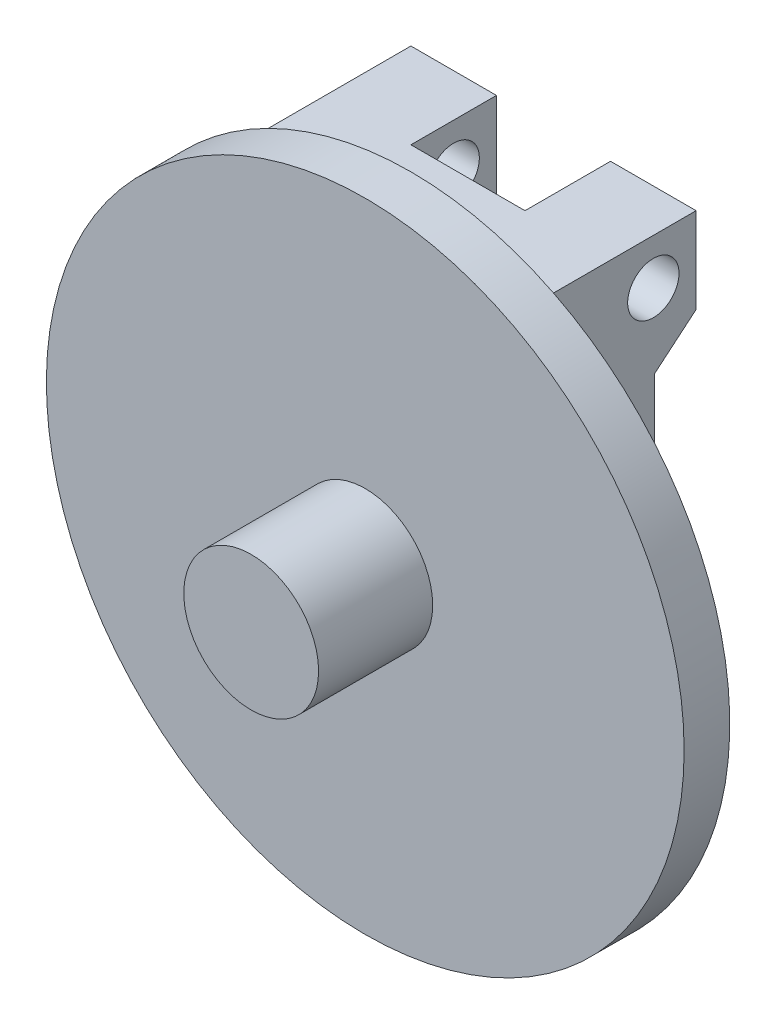
ISO-10303-21;
HEADER;
FILE_DESCRIPTION(('STEP AP214'),'2;1');
FILE_NAME('part.step','',(''),(''),'','','');
FILE_SCHEMA(('AUTOMOTIVE_DESIGN { 1 0 10303 214 1 1 1 1 }'));
ENDSEC;
DATA;
#1=APPLICATION_CONTEXT('core data for automotive mechanical design processes');
#2=APPLICATION_PROTOCOL_DEFINITION('international standard','automotive_design',2000,#1);
#3=PRODUCT_CONTEXT('',#1,'mechanical');
#4=PRODUCT('Part','Part','',(#3));
#5=PRODUCT_RELATED_PRODUCT_CATEGORY('part','',(#4));
#6=PRODUCT_DEFINITION_FORMATION('','',#4);
#7=PRODUCT_DEFINITION_CONTEXT('part definition',#1,'design');
#8=PRODUCT_DEFINITION('design','',#6,#7);
#9=PRODUCT_DEFINITION_SHAPE('','',#8);
#10=(LENGTH_UNIT() NAMED_UNIT(*) SI_UNIT(.MILLI.,.METRE.));
#11=(NAMED_UNIT(*) PLANE_ANGLE_UNIT() SI_UNIT($,.RADIAN.));
#12=(NAMED_UNIT(*) SI_UNIT($,.STERADIAN.) SOLID_ANGLE_UNIT());
#13=UNCERTAINTY_MEASURE_WITH_UNIT(LENGTH_MEASURE(1.E-05),#10,'distance_accuracy_value','');
#14=(GEOMETRIC_REPRESENTATION_CONTEXT(3) GLOBAL_UNCERTAINTY_ASSIGNED_CONTEXT((#13)) GLOBAL_UNIT_ASSIGNED_CONTEXT((#10,
#11,#12)) REPRESENTATION_CONTEXT('',''));
#15=CARTESIAN_POINT('',(0.,0.,0.));
#16=DIRECTION('',(0.,0.,1.));
#17=DIRECTION('',(1.,0.,0.));
#18=AXIS2_PLACEMENT_3D('',#15,#16,#17);
#19=CARTESIAN_POINT('',(-25.,-50.,10.));
#20=DIRECTION('',(1.,0.,0.));
#21=DIRECTION('',(0.,0.,-1.));
#22=AXIS2_PLACEMENT_3D('',#19,#20,#21);
#23=PLANE('',#22);
#24=DIRECTION('',(0.,0.,-1.));
#25=VECTOR('',#24,1.);
#26=CARTESIAN_POINT('',(-25.,50.,10.));
#27=LINE('',#26,#25);
#28=CARTESIAN_POINT('',(-25.,50.,10.));
#29=VERTEX_POINT('',#28);
#30=CARTESIAN_POINT('',(-25.,50.,-15.));
#31=VERTEX_POINT('',#30);
#32=EDGE_CURVE('E158',#29,#31,#27,.T.);
#33=ORIENTED_EDGE('',*,*,#32,.T.);
#34=DIRECTION('',(0.,1.,0.));
#35=VECTOR('',#34,1.);
#36=CARTESIAN_POINT('',(-25.,50.,-15.));
#37=LINE('',#36,#35);
#38=CARTESIAN_POINT('',(-25.,35.,-15.));
#39=VERTEX_POINT('',#38);
#40=EDGE_CURVE('E325',#39,#31,#37,.T.);
#41=ORIENTED_EDGE('',*,*,#40,.F.);
#42=DIRECTION('',(0.,0.642787609686538,-0.766044443118979));
#43=VECTOR('',#42,1.);
#44=CARTESIAN_POINT('',(-25.,35.,-15.));
#45=LINE('',#44,#43);
#46=CARTESIAN_POINT('',(-25.,28.8621789042122,-7.68522965839431));
#47=VERTEX_POINT('',#46);
#48=EDGE_CURVE('E347',#47,#39,#45,.T.);
#49=ORIENTED_EDGE('',*,*,#48,.F.);
#50=DIRECTION('',(0.,1.,0.));
#51=VECTOR('',#50,1.);
#52=CARTESIAN_POINT('',(-25.,28.8621789042122,-7.68522965839431));
#53=LINE('',#52,#51);
#54=CARTESIAN_POINT('',(-25.,-28.8621789042122,-7.68522965839431));
#55=VERTEX_POINT('',#54);
#56=EDGE_CURVE('E349',#55,#47,#53,.T.);
#57=ORIENTED_EDGE('',*,*,#56,.F.);
#58=DIRECTION('',(0.,0.642787609686537,0.76604444311898));
#59=VECTOR('',#58,1.);
#60=CARTESIAN_POINT('',(-25.,-28.8621789042122,-7.68522965839431));
#61=LINE('',#60,#59);
#62=CARTESIAN_POINT('',(-25.,-35.,-15.));
#63=VERTEX_POINT('',#62);
#64=EDGE_CURVE('E351',#63,#55,#61,.T.);
#65=ORIENTED_EDGE('',*,*,#64,.F.);
#66=DIRECTION('',(0.,1.,0.));
#67=VECTOR('',#66,1.);
#68=CARTESIAN_POINT('',(-25.,-35.,-15.));
#69=LINE('',#68,#67);
#70=CARTESIAN_POINT('',(-25.,-50.,-15.));
#71=VERTEX_POINT('',#70);
#72=EDGE_CURVE('E332',#71,#63,#69,.T.);
#73=ORIENTED_EDGE('',*,*,#72,.F.);
#74=DIRECTION('',(0.,0.,-1.));
#75=VECTOR('',#74,1.);
#76=CARTESIAN_POINT('',(-25.,-50.,10.));
#77=LINE('',#76,#75);
#78=CARTESIAN_POINT('',(-25.,-50.,10.));
#79=VERTEX_POINT('',#78);
#80=EDGE_CURVE('E42',#79,#71,#77,.T.);
#81=ORIENTED_EDGE('',*,*,#80,.F.);
#82=DIRECTION('',(0.,-1.,0.));
#83=VECTOR('',#82,1.);
#84=CARTESIAN_POINT('',(-25.,-50.,10.));
#85=LINE('',#84,#83);
#86=EDGE_CURVE('E154',#29,#79,#85,.T.);
#87=ORIENTED_EDGE('',*,*,#86,.F.);
#88=EDGE_LOOP('',(#33,#41,#49,#57,#65,#73,#81,#87));
#89=FACE_BOUND('',#88,.T.);
#90=CARTESIAN_POINT('',(-25.,-42.,-7.68522965839431));
#91=DIRECTION('',(1.,0.,0.));
#92=DIRECTION('',(0.,0.,-1.));
#93=AXIS2_PLACEMENT_3D('',#90,#91,#92);
#94=CIRCLE('',#93,4.5);
#95=CARTESIAN_POINT('',(-25.,-42.,-12.1852296583943));
#96=VERTEX_POINT('',#95);
#97=EDGE_CURVE('E320',#96,#96,#94,.T.);
#98=ORIENTED_EDGE('',*,*,#97,.T.);
#99=EDGE_LOOP('',(#98));
#100=FACE_BOUND('',#99,.T.);
#101=CARTESIAN_POINT('',(-25.,42.,-7.5));
#102=DIRECTION('',(1.,0.,0.));
#103=DIRECTION('',(0.,0.,-1.));
#104=AXIS2_PLACEMENT_3D('',#101,#102,#103);
#105=CIRCLE('',#104,4.50000000000001);
#106=CARTESIAN_POINT('',(-25.,42.,-12.));
#107=VERTEX_POINT('',#106);
#108=EDGE_CURVE('E197',#107,#107,#105,.T.);
#109=ORIENTED_EDGE('',*,*,#108,.T.);
#110=EDGE_LOOP('',(#109));
#111=FACE_BOUND('',#110,.T.);
#112=ADVANCED_FACE('F39',(#89,#100,#111),#23,.F.);
#113=CARTESIAN_POINT('',(25.,-50.,10.));
#114=DIRECTION('',(0.,1.,0.));
#115=DIRECTION('',(-1.,0.,0.));
#116=AXIS2_PLACEMENT_3D('',#113,#114,#115);
#117=PLANE('',#116);
#118=ORIENTED_EDGE('',*,*,#80,.T.);
#119=DIRECTION('',(-1.,0.,0.));
#120=VECTOR('',#119,1.);
#121=CARTESIAN_POINT('',(-10.,-50.,-15.));
#122=LINE('',#121,#120);
#123=CARTESIAN_POINT('',(-10.,-50.,-15.));
#124=VERTEX_POINT('',#123);
#125=EDGE_CURVE('E354',#124,#71,#122,.T.);
#126=ORIENTED_EDGE('',*,*,#125,.F.);
#127=DIRECTION('',(0.,0.,-1.));
#128=VECTOR('',#127,1.);
#129=CARTESIAN_POINT('',(-10.,-50.,-15.));
#130=LINE('',#129,#128);
#131=CARTESIAN_POINT('',(-10.,-50.,0.));
#132=VERTEX_POINT('',#131);
#133=EDGE_CURVE('E344',#132,#124,#130,.T.);
#134=ORIENTED_EDGE('',*,*,#133,.F.);
#135=DIRECTION('',(1.,0.,0.));
#136=VECTOR('',#135,1.);
#137=CARTESIAN_POINT('',(25.,-50.,0.));
#138=LINE('',#137,#136);
#139=CARTESIAN_POINT('',(10.,-50.,0.));
#140=VERTEX_POINT('',#139);
#141=EDGE_CURVE('E54',#132,#140,#138,.T.);
#142=ORIENTED_EDGE('',*,*,#141,.T.);
#143=DIRECTION('',(0.,0.,-1.));
#144=VECTOR('',#143,1.);
#145=CARTESIAN_POINT('',(10.,-50.,-15.));
#146=LINE('',#145,#144);
#147=CARTESIAN_POINT('',(10.,-50.,-15.));
#148=VERTEX_POINT('',#147);
#149=EDGE_CURVE('E386',#140,#148,#146,.T.);
#150=ORIENTED_EDGE('',*,*,#149,.T.);
#151=DIRECTION('',(1.,0.,0.));
#152=VECTOR('',#151,1.);
#153=CARTESIAN_POINT('',(10.,-50.,-15.));
#154=LINE('',#153,#152);
#155=CARTESIAN_POINT('',(25.,-50.,-15.));
#156=VERTEX_POINT('',#155);
#157=EDGE_CURVE('E407',#148,#156,#154,.T.);
#158=ORIENTED_EDGE('',*,*,#157,.T.);
#159=DIRECTION('',(0.,0.,-1.));
#160=VECTOR('',#159,1.);
#161=CARTESIAN_POINT('',(25.,-50.,10.));
#162=LINE('',#161,#160);
#163=CARTESIAN_POINT('',(25.,-50.,10.));
#164=VERTEX_POINT('',#163);
#165=EDGE_CURVE('E439',#164,#156,#162,.T.);
#166=ORIENTED_EDGE('',*,*,#165,.F.);
#167=DIRECTION('',(1.,0.,0.));
#168=VECTOR('',#167,1.);
#169=CARTESIAN_POINT('',(25.,-50.,10.));
#170=LINE('',#169,#168);
#171=EDGE_CURVE('E164',#79,#164,#170,.T.);
#172=ORIENTED_EDGE('',*,*,#171,.F.);
#173=EDGE_LOOP('',(#118,#126,#134,#142,#150,#158,#166,#172));
#174=FACE_BOUND('',#173,.T.);
#175=ADVANCED_FACE('F231',(#174),#117,.F.);
#176=CARTESIAN_POINT('',(25.,-50.,10.));
#177=DIRECTION('',(-1.,0.,0.));
#178=DIRECTION('',(0.,0.,1.));
#179=AXIS2_PLACEMENT_3D('',#176,#177,#178);
#180=PLANE('',#179);
#181=ORIENTED_EDGE('',*,*,#165,.T.);
#182=DIRECTION('',(0.,1.,0.));
#183=VECTOR('',#182,1.);
#184=CARTESIAN_POINT('',(25.,-35.,-15.));
#185=LINE('',#184,#183);
#186=CARTESIAN_POINT('',(25.,-35.,-15.));
#187=VERTEX_POINT('',#186);
#188=EDGE_CURVE('E380',#156,#187,#185,.T.);
#189=ORIENTED_EDGE('',*,*,#188,.T.);
#190=DIRECTION('',(0.,0.642787609686537,0.76604444311898));
#191=VECTOR('',#190,1.);
#192=CARTESIAN_POINT('',(25.,-28.8621789042122,-7.68522965839431));
#193=LINE('',#192,#191);
#194=CARTESIAN_POINT('',(25.,-28.8621789042122,-7.68522965839431));
#195=VERTEX_POINT('',#194);
#196=EDGE_CURVE('E410',#187,#195,#193,.T.);
#197=ORIENTED_EDGE('',*,*,#196,.T.);
#198=DIRECTION('',(0.,1.,0.));
#199=VECTOR('',#198,1.);
#200=CARTESIAN_POINT('',(25.,28.8621789042122,-7.68522965839431));
#201=LINE('',#200,#199);
#202=CARTESIAN_POINT('',(25.,28.8621789042122,-7.68522965839431));
#203=VERTEX_POINT('',#202);
#204=EDGE_CURVE('E413',#195,#203,#201,.T.);
#205=ORIENTED_EDGE('',*,*,#204,.T.);
#206=DIRECTION('',(0.,0.642787609686538,-0.766044443118979));
#207=VECTOR('',#206,1.);
#208=CARTESIAN_POINT('',(25.,35.,-15.));
#209=LINE('',#208,#207);
#210=CARTESIAN_POINT('',(25.,35.,-15.));
#211=VERTEX_POINT('',#210);
#212=EDGE_CURVE('E416',#203,#211,#209,.T.);
#213=ORIENTED_EDGE('',*,*,#212,.T.);
#214=DIRECTION('',(0.,1.,0.));
#215=VECTOR('',#214,1.);
#216=CARTESIAN_POINT('',(25.,50.,-15.));
#217=LINE('',#216,#215);
#218=CARTESIAN_POINT('',(25.,50.,-15.));
#219=VERTEX_POINT('',#218);
#220=EDGE_CURVE('E387',#211,#219,#217,.T.);
#221=ORIENTED_EDGE('',*,*,#220,.T.);
#222=DIRECTION('',(0.,0.,-1.));
#223=VECTOR('',#222,1.);
#224=CARTESIAN_POINT('',(25.,50.,10.));
#225=LINE('',#224,#223);
#226=CARTESIAN_POINT('',(25.,50.,10.));
#227=VERTEX_POINT('',#226);
#228=EDGE_CURVE('E62',#227,#219,#225,.T.);
#229=ORIENTED_EDGE('',*,*,#228,.F.);
#230=DIRECTION('',(0.,1.,0.));
#231=VECTOR('',#230,1.);
#232=CARTESIAN_POINT('',(25.,-50.,10.));
#233=LINE('',#232,#231);
#234=EDGE_CURVE('E182',#164,#227,#233,.T.);
#235=ORIENTED_EDGE('',*,*,#234,.F.);
#236=EDGE_LOOP('',(#181,#189,#197,#205,#213,#221,#229,#235));
#237=FACE_BOUND('',#236,.T.);
#238=CARTESIAN_POINT('',(25.,42.,-7.5));
#239=DIRECTION('',(1.,0.,0.));
#240=DIRECTION('',(0.,0.,-1.));
#241=AXIS2_PLACEMENT_3D('',#238,#239,#240);
#242=CIRCLE('',#241,4.50000000000001);
#243=CARTESIAN_POINT('',(25.,42.,-12.));
#244=VERTEX_POINT('',#243);
#245=EDGE_CURVE('E357',#244,#244,#242,.T.);
#246=ORIENTED_EDGE('',*,*,#245,.F.);
#247=EDGE_LOOP('',(#246));
#248=FACE_BOUND('',#247,.T.);
#249=CARTESIAN_POINT('',(25.,-42.,-7.68522965839431));
#250=DIRECTION('',(1.,0.,0.));
#251=DIRECTION('',(0.,0.,-1.));
#252=AXIS2_PLACEMENT_3D('',#249,#250,#251);
#253=CIRCLE('',#252,4.5);
#254=CARTESIAN_POINT('',(25.,-42.,-12.1852296583943));
#255=VERTEX_POINT('',#254);
#256=EDGE_CURVE('E374',#255,#255,#253,.T.);
#257=ORIENTED_EDGE('',*,*,#256,.F.);
#258=EDGE_LOOP('',(#257));
#259=FACE_BOUND('',#258,.T.);
#260=ADVANCED_FACE('F236',(#237,#248,#259),#180,.F.);
#261=CARTESIAN_POINT('',(25.,50.,10.));
#262=DIRECTION('',(0.,-1.,0.));
#263=DIRECTION('',(1.,0.,0.));
#264=AXIS2_PLACEMENT_3D('',#261,#262,#263);
#265=PLANE('',#264);
#266=ORIENTED_EDGE('',*,*,#228,.T.);
#267=DIRECTION('',(1.,0.,0.));
#268=VECTOR('',#267,1.);
#269=CARTESIAN_POINT('',(10.,50.,-15.));
#270=LINE('',#269,#268);
#271=CARTESIAN_POINT('',(10.,50.,-15.));
#272=VERTEX_POINT('',#271);
#273=EDGE_CURVE('E420',#272,#219,#270,.T.);
#274=ORIENTED_EDGE('',*,*,#273,.F.);
#275=DIRECTION('',(0.,0.,1.));
#276=VECTOR('',#275,1.);
#277=CARTESIAN_POINT('',(10.,50.,0.));
#278=LINE('',#277,#276);
#279=CARTESIAN_POINT('',(10.,50.,0.));
#280=VERTEX_POINT('',#279);
#281=EDGE_CURVE('E404',#272,#280,#278,.T.);
#282=ORIENTED_EDGE('',*,*,#281,.T.);
#283=DIRECTION('',(-1.,0.,0.));
#284=VECTOR('',#283,1.);
#285=CARTESIAN_POINT('',(25.,50.,0.));
#286=LINE('',#285,#284);
#287=CARTESIAN_POINT('',(-10.,50.,0.));
#288=VERTEX_POINT('',#287);
#289=EDGE_CURVE('E165',#280,#288,#286,.T.);
#290=ORIENTED_EDGE('',*,*,#289,.T.);
#291=DIRECTION('',(0.,0.,1.));
#292=VECTOR('',#291,1.);
#293=CARTESIAN_POINT('',(-10.,50.,0.));
#294=LINE('',#293,#292);
#295=CARTESIAN_POINT('',(-10.,50.,-15.));
#296=VERTEX_POINT('',#295);
#297=EDGE_CURVE('E331',#296,#288,#294,.T.);
#298=ORIENTED_EDGE('',*,*,#297,.F.);
#299=DIRECTION('',(-1.,0.,0.));
#300=VECTOR('',#299,1.);
#301=CARTESIAN_POINT('',(-10.,50.,-15.));
#302=LINE('',#301,#300);
#303=EDGE_CURVE('E175',#296,#31,#302,.T.);
#304=ORIENTED_EDGE('',*,*,#303,.T.);
#305=ORIENTED_EDGE('',*,*,#32,.F.);
#306=DIRECTION('',(-1.,0.,0.));
#307=VECTOR('',#306,1.);
#308=CARTESIAN_POINT('',(25.,50.,10.));
#309=LINE('',#308,#307);
#310=EDGE_CURVE('E171',#227,#29,#309,.T.);
#311=ORIENTED_EDGE('',*,*,#310,.F.);
#312=EDGE_LOOP('',(#266,#274,#282,#290,#298,#304,#305,#311));
#313=FACE_BOUND('',#312,.T.);
#314=ADVANCED_FACE('F170',(#313),#265,.F.);
#315=CARTESIAN_POINT('',(0.,0.,0.));
#316=DIRECTION('',(0.,0.,1.));
#317=DIRECTION('',(1.,0.,0.));
#318=AXIS2_PLACEMENT_3D('',#315,#316,#317);
#319=PLANE('',#318);
#320=ORIENTED_EDGE('',*,*,#141,.F.);
#321=DIRECTION('',(0.,-1.,0.));
#322=VECTOR('',#321,1.);
#323=CARTESIAN_POINT('',(-10.,-50.,0.));
#324=LINE('',#323,#322);
#325=EDGE_CURVE('E328',#288,#132,#324,.T.);
#326=ORIENTED_EDGE('',*,*,#325,.F.);
#327=ORIENTED_EDGE('',*,*,#289,.F.);
#328=DIRECTION('',(0.,-1.,0.));
#329=VECTOR('',#328,1.);
#330=CARTESIAN_POINT('',(10.,-50.,0.));
#331=LINE('',#330,#329);
#332=EDGE_CURVE('E383',#280,#140,#331,.T.);
#333=ORIENTED_EDGE('',*,*,#332,.T.);
#334=EDGE_LOOP('',(#320,#326,#327,#333));
#335=FACE_BOUND('',#334,.T.);
#336=ADVANCED_FACE('F244',(#335),#319,.F.);
#337=CARTESIAN_POINT('',(10.,50.,-15.));
#338=DIRECTION('',(0.,0.,-1.));
#339=DIRECTION('',(0.,1.,0.));
#340=AXIS2_PLACEMENT_3D('',#337,#338,#339);
#341=PLANE('',#340);
#342=ORIENTED_EDGE('',*,*,#220,.F.);
#343=DIRECTION('',(1.,0.,0.));
#344=VECTOR('',#343,1.);
#345=CARTESIAN_POINT('',(10.,35.,-15.));
#346=LINE('',#345,#344);
#347=CARTESIAN_POINT('',(10.,35.,-15.));
#348=VERTEX_POINT('',#347);
#349=EDGE_CURVE('E423',#348,#211,#346,.T.);
#350=ORIENTED_EDGE('',*,*,#349,.F.);
#351=DIRECTION('',(0.,1.,0.));
#352=VECTOR('',#351,1.);
#353=CARTESIAN_POINT('',(10.,50.,-15.));
#354=LINE('',#353,#352);
#355=EDGE_CURVE('E401',#348,#272,#354,.T.);
#356=ORIENTED_EDGE('',*,*,#355,.T.);
#357=ORIENTED_EDGE('',*,*,#273,.T.);
#358=EDGE_LOOP('',(#342,#350,#356,#357));
#359=FACE_BOUND('',#358,.T.);
#360=ADVANCED_FACE('F247',(#359),#341,.T.);
#361=CARTESIAN_POINT('',(10.,35.,-15.));
#362=DIRECTION('',(0.,-0.766044443118979,-0.642787609686538));
#363=DIRECTION('',(0.,0.642787609686538,-0.766044443118979));
#364=AXIS2_PLACEMENT_3D('',#361,#362,#363);
#365=PLANE('',#364);
#366=ORIENTED_EDGE('',*,*,#212,.F.);
#367=DIRECTION('',(1.,0.,0.));
#368=VECTOR('',#367,1.);
#369=CARTESIAN_POINT('',(10.,28.8621789042122,-7.68522965839431));
#370=LINE('',#369,#368);
#371=CARTESIAN_POINT('',(10.,28.8621789042122,-7.68522965839431));
#372=VERTEX_POINT('',#371);
#373=EDGE_CURVE('E425',#372,#203,#370,.T.);
#374=ORIENTED_EDGE('',*,*,#373,.F.);
#375=DIRECTION('',(0.,0.642787609686538,-0.766044443118979));
#376=VECTOR('',#375,1.);
#377=CARTESIAN_POINT('',(10.,35.,-15.));
#378=LINE('',#377,#376);
#379=EDGE_CURVE('E398',#372,#348,#378,.T.);
#380=ORIENTED_EDGE('',*,*,#379,.T.);
#381=ORIENTED_EDGE('',*,*,#349,.T.);
#382=EDGE_LOOP('',(#366,#374,#380,#381));
#383=FACE_BOUND('',#382,.T.);
#384=ADVANCED_FACE('F261',(#383),#365,.T.);
#385=CARTESIAN_POINT('',(10.,28.8621789042122,-7.68522965839431));
#386=DIRECTION('',(0.,0.,-1.));
#387=DIRECTION('',(0.,1.,0.));
#388=AXIS2_PLACEMENT_3D('',#385,#386,#387);
#389=PLANE('',#388);
#390=ORIENTED_EDGE('',*,*,#204,.F.);
#391=DIRECTION('',(1.,0.,0.));
#392=VECTOR('',#391,1.);
#393=CARTESIAN_POINT('',(10.,-28.8621789042122,-7.68522965839431));
#394=LINE('',#393,#392);
#395=CARTESIAN_POINT('',(10.,-28.8621789042122,-7.68522965839431));
#396=VERTEX_POINT('',#395);
#397=EDGE_CURVE('E427',#396,#195,#394,.T.);
#398=ORIENTED_EDGE('',*,*,#397,.F.);
#399=DIRECTION('',(0.,1.,0.));
#400=VECTOR('',#399,1.);
#401=CARTESIAN_POINT('',(10.,28.8621789042122,-7.68522965839431));
#402=LINE('',#401,#400);
#403=EDGE_CURVE('E395',#396,#372,#402,.T.);
#404=ORIENTED_EDGE('',*,*,#403,.T.);
#405=ORIENTED_EDGE('',*,*,#373,.T.);
#406=EDGE_LOOP('',(#390,#398,#404,#405));
#407=FACE_BOUND('',#406,.T.);
#408=ADVANCED_FACE('F257',(#407),#389,.T.);
#409=CARTESIAN_POINT('',(10.,-28.8621789042122,-7.68522965839431));
#410=DIRECTION('',(0.,0.76604444311898,-0.642787609686537));
#411=DIRECTION('',(0.,0.642787609686537,0.76604444311898));
#412=AXIS2_PLACEMENT_3D('',#409,#410,#411);
#413=PLANE('',#412);
#414=ORIENTED_EDGE('',*,*,#196,.F.);
#415=DIRECTION('',(1.,0.,0.));
#416=VECTOR('',#415,1.);
#417=CARTESIAN_POINT('',(10.,-35.,-15.));
#418=LINE('',#417,#416);
#419=CARTESIAN_POINT('',(10.,-35.,-15.));
#420=VERTEX_POINT('',#419);
#421=EDGE_CURVE('E429',#420,#187,#418,.T.);
#422=ORIENTED_EDGE('',*,*,#421,.F.);
#423=DIRECTION('',(0.,0.642787609686537,0.76604444311898));
#424=VECTOR('',#423,1.);
#425=CARTESIAN_POINT('',(10.,-28.8621789042122,-7.68522965839431));
#426=LINE('',#425,#424);
#427=EDGE_CURVE('E392',#420,#396,#426,.T.);
#428=ORIENTED_EDGE('',*,*,#427,.T.);
#429=ORIENTED_EDGE('',*,*,#397,.T.);
#430=EDGE_LOOP('',(#414,#422,#428,#429));
#431=FACE_BOUND('',#430,.T.);
#432=ADVANCED_FACE('F253',(#431),#413,.T.);
#433=CARTESIAN_POINT('',(10.,-35.,-15.));
#434=DIRECTION('',(0.,0.,-1.));
#435=DIRECTION('',(0.,1.,0.));
#436=AXIS2_PLACEMENT_3D('',#433,#434,#435);
#437=PLANE('',#436);
#438=ORIENTED_EDGE('',*,*,#188,.F.);
#439=ORIENTED_EDGE('',*,*,#157,.F.);
#440=DIRECTION('',(0.,1.,0.));
#441=VECTOR('',#440,1.);
#442=CARTESIAN_POINT('',(10.,-35.,-15.));
#443=LINE('',#442,#441);
#444=EDGE_CURVE('E389',#148,#420,#443,.T.);
#445=ORIENTED_EDGE('',*,*,#444,.T.);
#446=ORIENTED_EDGE('',*,*,#421,.T.);
#447=EDGE_LOOP('',(#438,#439,#445,#446));
#448=FACE_BOUND('',#447,.T.);
#449=ADVANCED_FACE('F249',(#448),#437,.T.);
#450=CARTESIAN_POINT('',(10.,0.,0.));
#451=DIRECTION('',(-1.,0.,0.));
#452=DIRECTION('',(0.,0.,1.));
#453=AXIS2_PLACEMENT_3D('',#450,#451,#452);
#454=PLANE('',#453);
#455=CARTESIAN_POINT('',(10.,42.,-7.5));
#456=DIRECTION('',(1.,0.,0.));
#457=DIRECTION('',(0.,0.,-1.));
#458=AXIS2_PLACEMENT_3D('',#455,#456,#457);
#459=CIRCLE('',#458,4.50000000000001);
#460=CARTESIAN_POINT('',(10.,42.,-12.));
#461=VERTEX_POINT('',#460);
#462=EDGE_CURVE('E371',#461,#461,#459,.T.);
#463=ORIENTED_EDGE('',*,*,#462,.T.);
#464=EDGE_LOOP('',(#463));
#465=FACE_BOUND('',#464,.T.);
#466=CARTESIAN_POINT('',(10.,-42.,-7.68522965839431));
#467=DIRECTION('',(1.,0.,0.));
#468=DIRECTION('',(0.,0.,-1.));
#469=AXIS2_PLACEMENT_3D('',#466,#467,#468);
#470=CIRCLE('',#469,4.5);
#471=CARTESIAN_POINT('',(10.,-42.,-12.1852296583943));
#472=VERTEX_POINT('',#471);
#473=EDGE_CURVE('E377',#472,#472,#470,.T.);
#474=ORIENTED_EDGE('',*,*,#473,.T.);
#475=EDGE_LOOP('',(#474));
#476=FACE_BOUND('',#475,.T.);
#477=ORIENTED_EDGE('',*,*,#332,.F.);
#478=ORIENTED_EDGE('',*,*,#281,.F.);
#479=ORIENTED_EDGE('',*,*,#355,.F.);
#480=ORIENTED_EDGE('',*,*,#379,.F.);
#481=ORIENTED_EDGE('',*,*,#403,.F.);
#482=ORIENTED_EDGE('',*,*,#427,.F.);
#483=ORIENTED_EDGE('',*,*,#444,.F.);
#484=ORIENTED_EDGE('',*,*,#149,.F.);
#485=EDGE_LOOP('',(#477,#478,#479,#480,#481,#482,#483,#484));
#486=FACE_BOUND('',#485,.T.);
#487=ADVANCED_FACE('F252',(#465,#476,#486),#454,.T.);
#488=CARTESIAN_POINT('',(10.,-42.,-7.68522965839431));
#489=DIRECTION('',(1.,0.,0.));
#490=DIRECTION('',(0.,0.,-1.));
#491=AXIS2_PLACEMENT_3D('',#488,#489,#490);
#492=CYLINDRICAL_SURFACE('',#491,4.5);
#493=ORIENTED_EDGE('',*,*,#473,.F.);
#494=EDGE_LOOP('',(#493));
#495=FACE_BOUND('',#494,.T.);
#496=ORIENTED_EDGE('',*,*,#256,.T.);
#497=EDGE_LOOP('',(#496));
#498=FACE_BOUND('',#497,.T.);
#499=ADVANCED_FACE('F271',(#495,#498),#492,.F.);
#500=CARTESIAN_POINT('',(10.,42.,-7.5));
#501=DIRECTION('',(1.,0.,0.));
#502=DIRECTION('',(0.,0.,-1.));
#503=AXIS2_PLACEMENT_3D('',#500,#501,#502);
#504=CYLINDRICAL_SURFACE('',#503,4.50000000000001);
#505=ORIENTED_EDGE('',*,*,#462,.F.);
#506=EDGE_LOOP('',(#505));
#507=FACE_BOUND('',#506,.T.);
#508=ORIENTED_EDGE('',*,*,#245,.T.);
#509=EDGE_LOOP('',(#508));
#510=FACE_BOUND('',#509,.T.);
#511=ADVANCED_FACE('F275',(#507,#510),#504,.F.);
#512=CARTESIAN_POINT('',(-10.,0.,0.));
#513=DIRECTION('',(1.,0.,0.));
#514=DIRECTION('',(0.,0.,1.));
#515=AXIS2_PLACEMENT_3D('',#512,#513,#514);
#516=PLANE('',#515);
#517=CARTESIAN_POINT('',(-10.,-42.,-7.68522965839431));
#518=DIRECTION('',(1.,0.,0.));
#519=DIRECTION('',(0.,0.,-1.));
#520=AXIS2_PLACEMENT_3D('',#517,#518,#519);
#521=CIRCLE('',#520,4.5);
#522=CARTESIAN_POINT('',(-10.,-42.,-12.1852296583943));
#523=VERTEX_POINT('',#522);
#524=EDGE_CURVE('E322',#523,#523,#521,.T.);
#525=ORIENTED_EDGE('',*,*,#524,.F.);
#526=EDGE_LOOP('',(#525));
#527=FACE_BOUND('',#526,.T.);
#528=ORIENTED_EDGE('',*,*,#325,.T.);
#529=ORIENTED_EDGE('',*,*,#133,.T.);
#530=DIRECTION('',(0.,1.,0.));
#531=VECTOR('',#530,1.);
#532=CARTESIAN_POINT('',(-10.,-35.,-15.));
#533=LINE('',#532,#531);
#534=CARTESIAN_POINT('',(-10.,-35.,-15.));
#535=VERTEX_POINT('',#534);
#536=EDGE_CURVE('E342',#124,#535,#533,.T.);
#537=ORIENTED_EDGE('',*,*,#536,.T.);
#538=DIRECTION('',(0.,0.642787609686537,0.76604444311898));
#539=VECTOR('',#538,1.);
#540=CARTESIAN_POINT('',(-10.,-28.8621789042122,-7.68522965839431));
#541=LINE('',#540,#539);
#542=CARTESIAN_POINT('',(-10.,-28.8621789042122,-7.68522965839431));
#543=VERTEX_POINT('',#542);
#544=EDGE_CURVE('E340',#535,#543,#541,.T.);
#545=ORIENTED_EDGE('',*,*,#544,.T.);
#546=DIRECTION('',(0.,1.,0.));
#547=VECTOR('',#546,1.);
#548=CARTESIAN_POINT('',(-10.,28.8621789042122,-7.68522965839431));
#549=LINE('',#548,#547);
#550=CARTESIAN_POINT('',(-10.,28.8621789042122,-7.68522965839431));
#551=VERTEX_POINT('',#550);
#552=EDGE_CURVE('E338',#543,#551,#549,.T.);
#553=ORIENTED_EDGE('',*,*,#552,.T.);
#554=DIRECTION('',(0.,0.642787609686538,-0.766044443118979));
#555=VECTOR('',#554,1.);
#556=CARTESIAN_POINT('',(-10.,35.,-15.));
#557=LINE('',#556,#555);
#558=CARTESIAN_POINT('',(-10.,35.,-15.));
#559=VERTEX_POINT('',#558);
#560=EDGE_CURVE('E336',#551,#559,#557,.T.);
#561=ORIENTED_EDGE('',*,*,#560,.T.);
#562=DIRECTION('',(0.,1.,0.));
#563=VECTOR('',#562,1.);
#564=CARTESIAN_POINT('',(-10.,50.,-15.));
#565=LINE('',#564,#563);
#566=EDGE_CURVE('E334',#559,#296,#565,.T.);
#567=ORIENTED_EDGE('',*,*,#566,.T.);
#568=ORIENTED_EDGE('',*,*,#297,.T.);
#569=EDGE_LOOP('',(#528,#529,#537,#545,#553,#561,#567,#568));
#570=FACE_BOUND('',#569,.T.);
#571=CARTESIAN_POINT('',(-10.,42.,-7.5));
#572=DIRECTION('',(1.,0.,0.));
#573=DIRECTION('',(0.,0.,-1.));
#574=AXIS2_PLACEMENT_3D('',#571,#572,#573);
#575=CIRCLE('',#574,4.50000000000001);
#576=CARTESIAN_POINT('',(-10.,42.,-12.));
#577=VERTEX_POINT('',#576);
#578=EDGE_CURVE('E315',#577,#577,#575,.T.);
#579=ORIENTED_EDGE('',*,*,#578,.F.);
#580=EDGE_LOOP('',(#579));
#581=FACE_BOUND('',#580,.T.);
#582=ADVANCED_FACE('F279',(#527,#570,#581),#516,.T.);
#583=CARTESIAN_POINT('',(-10.,-35.,-15.));
#584=DIRECTION('',(0.,0.,1.));
#585=DIRECTION('',(0.,-1.,0.));
#586=AXIS2_PLACEMENT_3D('',#583,#584,#585);
#587=PLANE('',#586);
#588=ORIENTED_EDGE('',*,*,#72,.T.);
#589=DIRECTION('',(-1.,0.,0.));
#590=VECTOR('',#589,1.);
#591=CARTESIAN_POINT('',(-10.,-35.,-15.));
#592=LINE('',#591,#590);
#593=EDGE_CURVE('E358',#535,#63,#592,.T.);
#594=ORIENTED_EDGE('',*,*,#593,.F.);
#595=ORIENTED_EDGE('',*,*,#536,.F.);
#596=ORIENTED_EDGE('',*,*,#125,.T.);
#597=EDGE_LOOP('',(#588,#594,#595,#596));
#598=FACE_BOUND('',#597,.T.);
#599=ADVANCED_FACE('F297',(#598),#587,.F.);
#600=CARTESIAN_POINT('',(-10.,-28.8621789042122,-7.68522965839431));
#601=DIRECTION('',(0.,-0.76604444311898,0.642787609686537));
#602=DIRECTION('',(0.,-0.642787609686537,-0.76604444311898));
#603=AXIS2_PLACEMENT_3D('',#600,#601,#602);
#604=PLANE('',#603);
#605=ORIENTED_EDGE('',*,*,#64,.T.);
#606=DIRECTION('',(-1.,0.,0.));
#607=VECTOR('',#606,1.);
#608=CARTESIAN_POINT('',(-10.,-28.8621789042122,-7.68522965839431));
#609=LINE('',#608,#607);
#610=EDGE_CURVE('E361',#543,#55,#609,.T.);
#611=ORIENTED_EDGE('',*,*,#610,.F.);
#612=ORIENTED_EDGE('',*,*,#544,.F.);
#613=ORIENTED_EDGE('',*,*,#593,.T.);
#614=EDGE_LOOP('',(#605,#611,#612,#613));
#615=FACE_BOUND('',#614,.T.);
#616=ADVANCED_FACE('F293',(#615),#604,.F.);
#617=CARTESIAN_POINT('',(-10.,28.8621789042122,-7.68522965839431));
#618=DIRECTION('',(0.,0.,1.));
#619=DIRECTION('',(0.,-1.,0.));
#620=AXIS2_PLACEMENT_3D('',#617,#618,#619);
#621=PLANE('',#620);
#622=ORIENTED_EDGE('',*,*,#56,.T.);
#623=DIRECTION('',(-1.,0.,0.));
#624=VECTOR('',#623,1.);
#625=CARTESIAN_POINT('',(-10.,28.8621789042122,-7.68522965839431));
#626=LINE('',#625,#624);
#627=EDGE_CURVE('E364',#551,#47,#626,.T.);
#628=ORIENTED_EDGE('',*,*,#627,.F.);
#629=ORIENTED_EDGE('',*,*,#552,.F.);
#630=ORIENTED_EDGE('',*,*,#610,.T.);
#631=EDGE_LOOP('',(#622,#628,#629,#630));
#632=FACE_BOUND('',#631,.T.);
#633=ADVANCED_FACE('F289',(#632),#621,.F.);
#634=CARTESIAN_POINT('',(-10.,35.,-15.));
#635=DIRECTION('',(0.,0.766044443118979,0.642787609686538));
#636=DIRECTION('',(0.,-0.642787609686538,0.766044443118979));
#637=AXIS2_PLACEMENT_3D('',#634,#635,#636);
#638=PLANE('',#637);
#639=ORIENTED_EDGE('',*,*,#48,.T.);
#640=DIRECTION('',(-1.,0.,0.));
#641=VECTOR('',#640,1.);
#642=CARTESIAN_POINT('',(-10.,35.,-15.));
#643=LINE('',#642,#641);
#644=EDGE_CURVE('E367',#559,#39,#643,.T.);
#645=ORIENTED_EDGE('',*,*,#644,.F.);
#646=ORIENTED_EDGE('',*,*,#560,.F.);
#647=ORIENTED_EDGE('',*,*,#627,.T.);
#648=EDGE_LOOP('',(#639,#645,#646,#647));
#649=FACE_BOUND('',#648,.T.);
#650=ADVANCED_FACE('F285',(#649),#638,.F.);
#651=CARTESIAN_POINT('',(-10.,50.,-15.));
#652=DIRECTION('',(0.,0.,1.));
#653=DIRECTION('',(0.,-1.,0.));
#654=AXIS2_PLACEMENT_3D('',#651,#652,#653);
#655=PLANE('',#654);
#656=ORIENTED_EDGE('',*,*,#40,.T.);
#657=ORIENTED_EDGE('',*,*,#303,.F.);
#658=ORIENTED_EDGE('',*,*,#566,.F.);
#659=ORIENTED_EDGE('',*,*,#644,.T.);
#660=EDGE_LOOP('',(#656,#657,#658,#659));
#661=FACE_BOUND('',#660,.T.);
#662=ADVANCED_FACE('F281',(#661),#655,.F.);
#663=CARTESIAN_POINT('',(-10.,-42.,-7.68522965839431));
#664=DIRECTION('',(-1.,0.,0.));
#665=DIRECTION('',(0.,0.,1.));
#666=AXIS2_PLACEMENT_3D('',#663,#664,#665);
#667=CYLINDRICAL_SURFACE('',#666,4.5);
#668=ORIENTED_EDGE('',*,*,#524,.T.);
#669=EDGE_LOOP('',(#668));
#670=FACE_BOUND('',#669,.T.);
#671=ORIENTED_EDGE('',*,*,#97,.F.);
#672=EDGE_LOOP('',(#671));
#673=FACE_BOUND('',#672,.T.);
#674=ADVANCED_FACE('F284',(#670,#673),#667,.F.);
#675=CARTESIAN_POINT('',(-10.,42.,-7.5));
#676=DIRECTION('',(-1.,0.,0.));
#677=DIRECTION('',(0.,0.,1.));
#678=AXIS2_PLACEMENT_3D('',#675,#676,#677);
#679=CYLINDRICAL_SURFACE('',#678,4.50000000000001);
#680=ORIENTED_EDGE('',*,*,#578,.T.);
#681=EDGE_LOOP('',(#680));
#682=FACE_BOUND('',#681,.T.);
#683=ORIENTED_EDGE('',*,*,#108,.F.);
#684=EDGE_LOOP('',(#683));
#685=FACE_BOUND('',#684,.T.);
#686=ADVANCED_FACE('F306',(#682,#685),#679,.F.);
#687=CARTESIAN_POINT('',(0.,0.,10.));
#688=DIRECTION('',(0.,0.,1.));
#689=DIRECTION('',(1.,0.,0.));
#690=AXIS2_PLACEMENT_3D('',#687,#688,#689);
#691=PLANE('',#690);
#692=CARTESIAN_POINT('',(0.,0.,10.));
#693=DIRECTION('',(0.,0.,1.));
#694=DIRECTION('',(1.,0.,0.));
#695=AXIS2_PLACEMENT_3D('',#692,#693,#694);
#696=CIRCLE('',#695,55.9016994374947);
#697=EDGE_CURVE('E185',#29,#79,#696,.T.);
#698=ORIENTED_EDGE('',*,*,#697,.F.);
#699=ORIENTED_EDGE('',*,*,#86,.T.);
#700=EDGE_LOOP('',(#698,#699));
#701=FACE_BOUND('',#700,.T.);
#702=ADVANCED_FACE('F186',(#701),#691,.F.);
#703=EDGE_CURVE('E189',#79,#164,#696,.T.);
#704=ORIENTED_EDGE('',*,*,#703,.F.);
#705=ORIENTED_EDGE('',*,*,#171,.T.);
#706=EDGE_LOOP('',(#704,#705));
#707=FACE_BOUND('',#706,.T.);
#708=ADVANCED_FACE('F226',(#707),#691,.F.);
#709=EDGE_CURVE('E194',#164,#227,#696,.T.);
#710=ORIENTED_EDGE('',*,*,#709,.F.);
#711=ORIENTED_EDGE('',*,*,#234,.T.);
#712=EDGE_LOOP('',(#710,#711));
#713=FACE_BOUND('',#712,.T.);
#714=ADVANCED_FACE('F220',(#713),#691,.F.);
#715=CARTESIAN_POINT('',(0.,0.,18.));
#716=DIRECTION('',(0.,0.,-1.));
#717=DIRECTION('',(-1.,0.,0.));
#718=AXIS2_PLACEMENT_3D('',#715,#716,#717);
#719=CYLINDRICAL_SURFACE('',#718,55.9016994374947);
#720=CARTESIAN_POINT('',(0.,0.,18.));
#721=DIRECTION('',(0.,0.,1.));
#722=DIRECTION('',(1.,0.,0.));
#723=AXIS2_PLACEMENT_3D('',#720,#721,#722);
#724=CIRCLE('',#723,55.9016994374947);
#725=CARTESIAN_POINT('',(55.9016994374947,0.,18.));
#726=VERTEX_POINT('',#725);
#727=EDGE_CURVE('E195',#726,#726,#724,.T.);
#728=ORIENTED_EDGE('',*,*,#727,.F.);
#729=EDGE_LOOP('',(#728));
#730=FACE_BOUND('',#729,.T.);
#731=EDGE_CURVE('E181',#227,#29,#696,.T.);
#732=ORIENTED_EDGE('',*,*,#731,.T.);
#733=ORIENTED_EDGE('',*,*,#697,.T.);
#734=ORIENTED_EDGE('',*,*,#703,.T.);
#735=ORIENTED_EDGE('',*,*,#709,.T.);
#736=EDGE_LOOP('',(#732,#733,#734,#735));
#737=FACE_BOUND('',#736,.T.);
#738=ADVANCED_FACE('F192',(#730,#737),#719,.T.);
#739=CARTESIAN_POINT('',(0.,0.,18.));
#740=DIRECTION('',(0.,0.,1.));
#741=DIRECTION('',(1.,0.,0.));
#742=AXIS2_PLACEMENT_3D('',#739,#740,#741);
#743=PLANE('',#742);
#744=CARTESIAN_POINT('',(0.,0.,18.));
#745=DIRECTION('',(0.,0.,1.));
#746=DIRECTION('',(1.,0.,0.));
#747=AXIS2_PLACEMENT_3D('',#744,#745,#746);
#748=CIRCLE('',#747,11.8172120272722);
#749=CARTESIAN_POINT('',(11.8172120272722,0.,18.));
#750=VERTEX_POINT('',#749);
#751=EDGE_CURVE('E11',#750,#750,#748,.T.);
#752=ORIENTED_EDGE('',*,*,#751,.F.);
#753=EDGE_LOOP('',(#752));
#754=FACE_BOUND('',#753,.T.);
#755=ORIENTED_EDGE('',*,*,#727,.T.);
#756=EDGE_LOOP('',(#755));
#757=FACE_BOUND('',#756,.T.);
#758=ADVANCED_FACE('F213',(#754,#757),#743,.T.);
#759=ORIENTED_EDGE('',*,*,#731,.F.);
#760=ORIENTED_EDGE('',*,*,#310,.T.);
#761=EDGE_LOOP('',(#759,#760));
#762=FACE_BOUND('',#761,.T.);
#763=ADVANCED_FACE('F179',(#762),#691,.F.);
#764=CARTESIAN_POINT('',(0.,0.,38.));
#765=DIRECTION('',(0.,0.,-1.));
#766=DIRECTION('',(-1.,0.,0.));
#767=AXIS2_PLACEMENT_3D('',#764,#765,#766);
#768=CYLINDRICAL_SURFACE('',#767,11.8172120272722);
#769=CARTESIAN_POINT('',(0.,0.,38.));
#770=DIRECTION('',(0.,0.,1.));
#771=DIRECTION('',(1.,0.,0.));
#772=AXIS2_PLACEMENT_3D('',#769,#770,#771);
#773=CIRCLE('',#772,11.8172120272722);
#774=CARTESIAN_POINT('',(11.8172120272722,0.,38.));
#775=VERTEX_POINT('',#774);
#776=EDGE_CURVE('E200',#775,#775,#773,.T.);
#777=ORIENTED_EDGE('',*,*,#776,.F.);
#778=EDGE_LOOP('',(#777));
#779=FACE_BOUND('',#778,.T.);
#780=ORIENTED_EDGE('',*,*,#751,.T.);
#781=EDGE_LOOP('',(#780));
#782=FACE_BOUND('',#781,.T.);
#783=ADVANCED_FACE('F207',(#779,#782),#768,.T.);
#784=CARTESIAN_POINT('',(0.,0.,38.));
#785=DIRECTION('',(0.,0.,1.));
#786=DIRECTION('',(1.,0.,0.));
#787=AXIS2_PLACEMENT_3D('',#784,#785,#786);
#788=PLANE('',#787);
#789=ORIENTED_EDGE('',*,*,#776,.T.);
#790=EDGE_LOOP('',(#789));
#791=FACE_BOUND('',#790,.T.);
#792=ADVANCED_FACE('F205',(#791),#788,.T.);
#793=CLOSED_SHELL('',(#112,#175,#260,#314,#336,#360,#384,#408,#432,#449,#487,#499,#511,#582,
#599,#616,#633,#650,#662,#674,#686,#702,#708,#714,#738,#758,#763,#783,#792));
#794=MANIFOLD_SOLID_BREP('B2',#793);
#795=ADVANCED_BREP_SHAPE_REPRESENTATION('',(#18,#794),#14);
#796=SHAPE_DEFINITION_REPRESENTATION(#9,#795);
ENDSEC;
END-ISO-10303-21;
